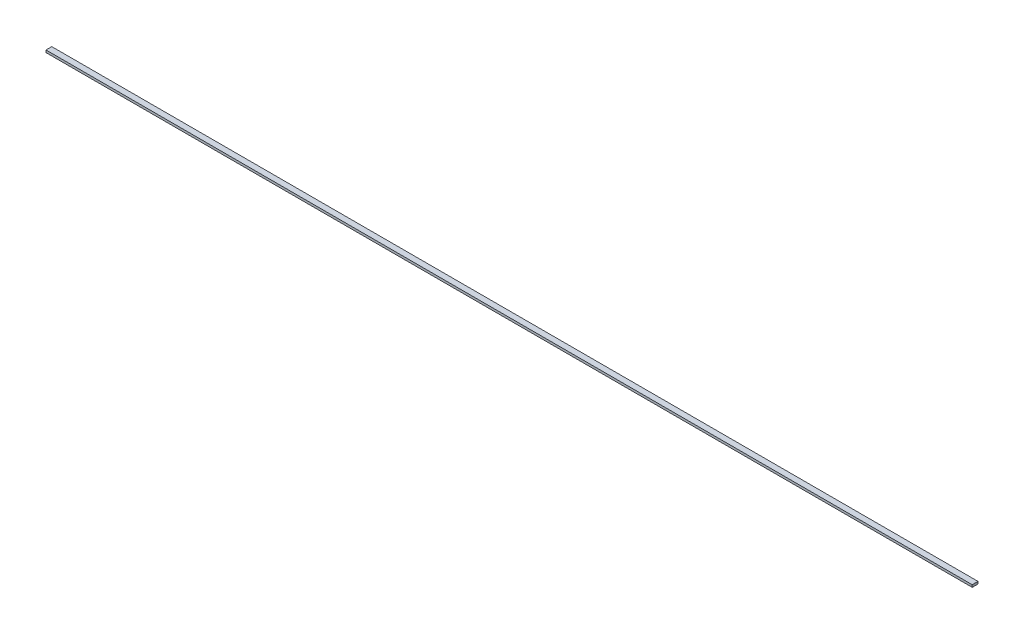
ISO-10303-21;
HEADER;
FILE_DESCRIPTION(('STEP AP214'),'2;1');
FILE_NAME('part.step','',(''),(''),'','','');
FILE_SCHEMA(('AUTOMOTIVE_DESIGN { 1 0 10303 214 1 1 1 1 }'));
ENDSEC;
DATA;
#1=APPLICATION_CONTEXT('core data for automotive mechanical design processes');
#2=APPLICATION_PROTOCOL_DEFINITION('international standard','automotive_design',2000,#1);
#3=PRODUCT_CONTEXT('',#1,'mechanical');
#4=PRODUCT('Part','Part','',(#3));
#5=PRODUCT_RELATED_PRODUCT_CATEGORY('part','',(#4));
#6=PRODUCT_DEFINITION_FORMATION('','',#4);
#7=PRODUCT_DEFINITION_CONTEXT('part definition',#1,'design');
#8=PRODUCT_DEFINITION('design','',#6,#7);
#9=PRODUCT_DEFINITION_SHAPE('','',#8);
#10=(LENGTH_UNIT() NAMED_UNIT(*) SI_UNIT(.MILLI.,.METRE.));
#11=(NAMED_UNIT(*) PLANE_ANGLE_UNIT() SI_UNIT($,.RADIAN.));
#12=(NAMED_UNIT(*) SI_UNIT($,.STERADIAN.) SOLID_ANGLE_UNIT());
#13=UNCERTAINTY_MEASURE_WITH_UNIT(LENGTH_MEASURE(1.E-05),#10,'distance_accuracy_value','');
#14=(GEOMETRIC_REPRESENTATION_CONTEXT(3) GLOBAL_UNCERTAINTY_ASSIGNED_CONTEXT((#13)) GLOBAL_UNIT_ASSIGNED_CONTEXT((#10,
#11,#12)) REPRESENTATION_CONTEXT('',''));
#15=CARTESIAN_POINT('',(0.,0.,0.));
#16=DIRECTION('',(0.,0.,1.));
#17=DIRECTION('',(1.,0.,0.));
#18=AXIS2_PLACEMENT_3D('',#15,#16,#17);
#19=CARTESIAN_POINT('',(-200.1,-0.5,2.5));
#20=DIRECTION('',(1.,0.,0.));
#21=DIRECTION('',(0.,0.,-1.));
#22=AXIS2_PLACEMENT_3D('',#19,#20,#21);
#23=PLANE('',#22);
#24=DIRECTION('',(0.,-1.,0.));
#25=VECTOR('',#24,1.);
#26=CARTESIAN_POINT('',(-200.1,-0.5,0.));
#27=LINE('',#26,#25);
#28=CARTESIAN_POINT('',(-200.1,0.5,0.));
#29=VERTEX_POINT('',#28);
#30=CARTESIAN_POINT('',(-200.1,-0.5,0.));
#31=VERTEX_POINT('',#30);
#32=EDGE_CURVE('E95',#29,#31,#27,.T.);
#33=ORIENTED_EDGE('',*,*,#32,.T.);
#34=DIRECTION('',(0.,0.,-1.));
#35=VECTOR('',#34,1.);
#36=CARTESIAN_POINT('',(-200.1,-0.5,2.5));
#37=LINE('',#36,#35);
#38=CARTESIAN_POINT('',(-200.1,-0.5,2.5));
#39=VERTEX_POINT('',#38);
#40=EDGE_CURVE('E11',#39,#31,#37,.T.);
#41=ORIENTED_EDGE('',*,*,#40,.F.);
#42=DIRECTION('',(0.,-1.,0.));
#43=VECTOR('',#42,1.);
#44=CARTESIAN_POINT('',(-200.1,-0.5,2.5));
#45=LINE('',#44,#43);
#46=CARTESIAN_POINT('',(-200.1,0.5,2.5));
#47=VERTEX_POINT('',#46);
#48=EDGE_CURVE('E83',#47,#39,#45,.T.);
#49=ORIENTED_EDGE('',*,*,#48,.F.);
#50=DIRECTION('',(0.,0.,-1.));
#51=VECTOR('',#50,1.);
#52=CARTESIAN_POINT('',(-200.1,0.5,2.5));
#53=LINE('',#52,#51);
#54=EDGE_CURVE('E91',#47,#29,#53,.T.);
#55=ORIENTED_EDGE('',*,*,#54,.T.);
#56=EDGE_LOOP('',(#33,#41,#49,#55));
#57=FACE_BOUND('',#56,.T.);
#58=ADVANCED_FACE('F32',(#57),#23,.F.);
#59=CARTESIAN_POINT('',(200.1,-0.5,2.5));
#60=DIRECTION('',(0.,1.,0.));
#61=DIRECTION('',(0.,0.,1.));
#62=AXIS2_PLACEMENT_3D('',#59,#60,#61);
#63=PLANE('',#62);
#64=DIRECTION('',(1.,0.,0.));
#65=VECTOR('',#64,1.);
#66=CARTESIAN_POINT('',(200.1,-0.5,0.));
#67=LINE('',#66,#65);
#68=CARTESIAN_POINT('',(200.1,-0.5,0.));
#69=VERTEX_POINT('',#68);
#70=EDGE_CURVE('E87',#31,#69,#67,.T.);
#71=ORIENTED_EDGE('',*,*,#70,.T.);
#72=DIRECTION('',(0.,0.,-1.));
#73=VECTOR('',#72,1.);
#74=CARTESIAN_POINT('',(200.1,-0.5,2.5));
#75=LINE('',#74,#73);
#76=CARTESIAN_POINT('',(200.1,-0.5,2.5));
#77=VERTEX_POINT('',#76);
#78=EDGE_CURVE('E40',#77,#69,#75,.T.);
#79=ORIENTED_EDGE('',*,*,#78,.F.);
#80=DIRECTION('',(1.,0.,0.));
#81=VECTOR('',#80,1.);
#82=CARTESIAN_POINT('',(200.1,-0.5,2.5));
#83=LINE('',#82,#81);
#84=EDGE_CURVE('E78',#39,#77,#83,.T.);
#85=ORIENTED_EDGE('',*,*,#84,.F.);
#86=ORIENTED_EDGE('',*,*,#40,.T.);
#87=EDGE_LOOP('',(#71,#79,#85,#86));
#88=FACE_BOUND('',#87,.T.);
#89=ADVANCED_FACE('F86',(#88),#63,.F.);
#90=CARTESIAN_POINT('',(200.1,-0.5,2.5));
#91=DIRECTION('',(-1.,0.,0.));
#92=DIRECTION('',(0.,0.,1.));
#93=AXIS2_PLACEMENT_3D('',#90,#91,#92);
#94=PLANE('',#93);
#95=DIRECTION('',(0.,1.,0.));
#96=VECTOR('',#95,1.);
#97=CARTESIAN_POINT('',(200.1,-0.5,0.));
#98=LINE('',#97,#96);
#99=CARTESIAN_POINT('',(200.1,0.5,0.));
#100=VERTEX_POINT('',#99);
#101=EDGE_CURVE('E65',#69,#100,#98,.T.);
#102=ORIENTED_EDGE('',*,*,#101,.T.);
#103=DIRECTION('',(0.,0.,-1.));
#104=VECTOR('',#103,1.);
#105=CARTESIAN_POINT('',(200.1,0.5,2.5));
#106=LINE('',#105,#104);
#107=CARTESIAN_POINT('',(200.1,0.5,2.5));
#108=VERTEX_POINT('',#107);
#109=EDGE_CURVE('E88',#108,#100,#106,.T.);
#110=ORIENTED_EDGE('',*,*,#109,.F.);
#111=DIRECTION('',(0.,1.,0.));
#112=VECTOR('',#111,1.);
#113=CARTESIAN_POINT('',(200.1,-0.5,2.5));
#114=LINE('',#113,#112);
#115=EDGE_CURVE('E81',#77,#108,#114,.T.);
#116=ORIENTED_EDGE('',*,*,#115,.F.);
#117=ORIENTED_EDGE('',*,*,#78,.T.);
#118=EDGE_LOOP('',(#102,#110,#116,#117));
#119=FACE_BOUND('',#118,.T.);
#120=ADVANCED_FACE('F89',(#119),#94,.F.);
#121=CARTESIAN_POINT('',(200.1,0.5,2.5));
#122=DIRECTION('',(0.,-1.,0.));
#123=DIRECTION('',(0.,0.,-1.));
#124=AXIS2_PLACEMENT_3D('',#121,#122,#123);
#125=PLANE('',#124);
#126=DIRECTION('',(-1.,0.,0.));
#127=VECTOR('',#126,1.);
#128=CARTESIAN_POINT('',(200.1,0.5,0.));
#129=LINE('',#128,#127);
#130=EDGE_CURVE('E71',#100,#29,#129,.T.);
#131=ORIENTED_EDGE('',*,*,#130,.T.);
#132=ORIENTED_EDGE('',*,*,#54,.F.);
#133=DIRECTION('',(-1.,0.,0.));
#134=VECTOR('',#133,1.);
#135=CARTESIAN_POINT('',(200.1,0.5,2.5));
#136=LINE('',#135,#134);
#137=EDGE_CURVE('E48',#108,#47,#136,.T.);
#138=ORIENTED_EDGE('',*,*,#137,.F.);
#139=ORIENTED_EDGE('',*,*,#109,.T.);
#140=EDGE_LOOP('',(#131,#132,#138,#139));
#141=FACE_BOUND('',#140,.T.);
#142=ADVANCED_FACE('F102',(#141),#125,.F.);
#143=CARTESIAN_POINT('',(0.,0.,2.5));
#144=DIRECTION('',(0.,0.,1.));
#145=DIRECTION('',(1.,0.,0.));
#146=AXIS2_PLACEMENT_3D('',#143,#144,#145);
#147=PLANE('',#146);
#148=ORIENTED_EDGE('',*,*,#48,.T.);
#149=ORIENTED_EDGE('',*,*,#84,.T.);
#150=ORIENTED_EDGE('',*,*,#115,.T.);
#151=ORIENTED_EDGE('',*,*,#137,.T.);
#152=EDGE_LOOP('',(#148,#149,#150,#151));
#153=FACE_BOUND('',#152,.T.);
#154=ADVANCED_FACE('F79',(#153),#147,.T.);
#155=CARTESIAN_POINT('',(0.,0.,0.));
#156=DIRECTION('',(0.,0.,1.));
#157=DIRECTION('',(1.,0.,0.));
#158=AXIS2_PLACEMENT_3D('',#155,#156,#157);
#159=PLANE('',#158);
#160=ORIENTED_EDGE('',*,*,#32,.F.);
#161=ORIENTED_EDGE('',*,*,#130,.F.);
#162=ORIENTED_EDGE('',*,*,#101,.F.);
#163=ORIENTED_EDGE('',*,*,#70,.F.);
#164=EDGE_LOOP('',(#160,#161,#162,#163));
#165=FACE_BOUND('',#164,.T.);
#166=ADVANCED_FACE('F105',(#165),#159,.F.);
#167=CLOSED_SHELL('',(#58,#89,#120,#142,#154,#166));
#168=MANIFOLD_SOLID_BREP('B2',#167);
#169=ADVANCED_BREP_SHAPE_REPRESENTATION('',(#18,#168),#14);
#170=SHAPE_DEFINITION_REPRESENTATION(#9,#169);
ENDSEC;
END-ISO-10303-21;
